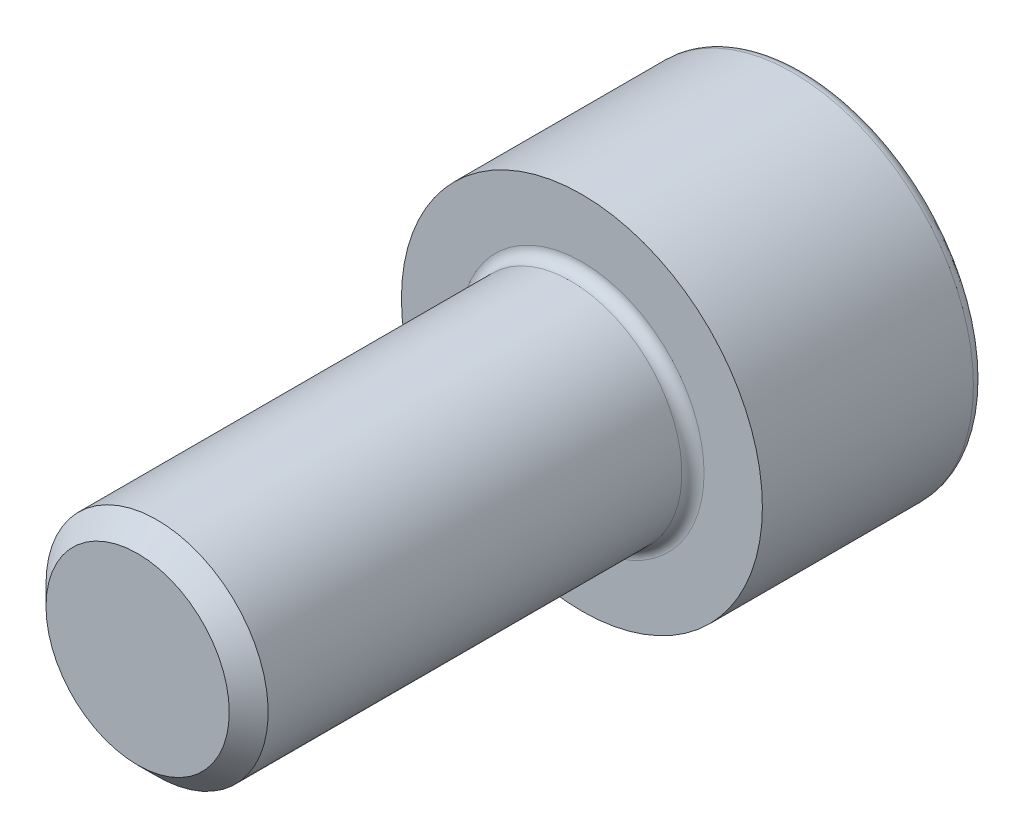
ISO-10303-21;
HEADER;
FILE_DESCRIPTION(('STEP AP214'),'2;1');
FILE_NAME('part.step','',(''),(''),'','','');
FILE_SCHEMA(('AUTOMOTIVE_DESIGN { 1 0 10303 214 1 1 1 1 }'));
ENDSEC;
DATA;
#1=APPLICATION_CONTEXT('core data for automotive mechanical design processes');
#2=APPLICATION_PROTOCOL_DEFINITION('international standard','automotive_design',2000,#1);
#3=PRODUCT_CONTEXT('',#1,'mechanical');
#4=PRODUCT('Part','Part','',(#3));
#5=PRODUCT_RELATED_PRODUCT_CATEGORY('part','',(#4));
#6=PRODUCT_DEFINITION_FORMATION('','',#4);
#7=PRODUCT_DEFINITION_CONTEXT('part definition',#1,'design');
#8=PRODUCT_DEFINITION('design','',#6,#7);
#9=PRODUCT_DEFINITION_SHAPE('','',#8);
#10=(LENGTH_UNIT() NAMED_UNIT(*) SI_UNIT(.MILLI.,.METRE.));
#11=(NAMED_UNIT(*) PLANE_ANGLE_UNIT() SI_UNIT($,.RADIAN.));
#12=(NAMED_UNIT(*) SI_UNIT($,.STERADIAN.) SOLID_ANGLE_UNIT());
#13=UNCERTAINTY_MEASURE_WITH_UNIT(LENGTH_MEASURE(1.E-05),#10,'distance_accuracy_value','');
#14=(GEOMETRIC_REPRESENTATION_CONTEXT(3) GLOBAL_UNCERTAINTY_ASSIGNED_CONTEXT((#13)) GLOBAL_UNIT_ASSIGNED_CONTEXT((#10,
#11,#12)) REPRESENTATION_CONTEXT('',''));
#15=CARTESIAN_POINT('',(0.,0.,0.));
#16=DIRECTION('',(0.,0.,1.));
#17=DIRECTION('',(1.,0.,0.));
#18=AXIS2_PLACEMENT_3D('',#15,#16,#17);
#19=CARTESIAN_POINT('',(-3.57706292844384E-05,-3.96873549196468E-06,-17.1526531246929));
#20=DIRECTION('',(0.,0.,1.));
#21=DIRECTION('',(1.,0.,0.));
#22=AXIS2_PLACEMENT_3D('',#19,#20,#21);
#23=PLANE('',#22);
#24=CARTESIAN_POINT('',(-3.57706292850889E-05,-3.98249819295871E-06,-17.1526531244246));
#25=DIRECTION('',(0.,0.,-1.));
#26=DIRECTION('',(-1.,0.,0.));
#27=AXIS2_PLACEMENT_3D('',#24,#25,#26);
#28=CIRCLE('',#27,1.49999999672391);
#29=CARTESIAN_POINT('',(-1.29907470093307,-0.750002547949316,-17.1526531245587));
#30=VERTEX_POINT('',#29);
#31=CARTESIAN_POINT('',(-0.000137367999756264,-1.50000396873549,-17.1526531253078));
#32=VERTEX_POINT('',#31);
#33=EDGE_CURVE('E140',#30,#32,#28,.F.);
#34=ORIENTED_EDGE('',*,*,#33,.T.);
#35=DIRECTION('',(1.,0.,0.));
#36=VECTOR('',#35,1.);
#37=CARTESIAN_POINT('',(-3.57706292844384E-05,-1.50000396873549,-17.1526531246929));
#38=LINE('',#37,#36);
#39=CARTESIAN_POINT('',(-0.866061174414315,-1.50000396873551,-17.1526531246929));
#40=VERTEX_POINT('',#39);
#41=EDGE_CURVE('E126',#40,#32,#38,.T.);
#42=ORIENTED_EDGE('',*,*,#41,.F.);
#43=DIRECTION('',(0.500000003443144,-0.866025401796539,0.));
#44=VECTOR('',#43,1.);
#45=CARTESIAN_POINT('',(-1.29907553097998,-0.750001109643268,-17.1526531246929));
#46=LINE('',#45,#44);
#47=EDGE_CURVE('E137',#30,#40,#46,.T.);
#48=ORIENTED_EDGE('',*,*,#47,.F.);
#49=EDGE_LOOP('',(#34,#42,#48));
#50=FACE_BOUND('',#49,.T.);
#51=ADVANCED_FACE('F48',(#50),#23,.F.);
#52=CARTESIAN_POINT('',(-3.57706292844384E-05,-3.96873549196468E-06,-17.1526531246929));
#53=DIRECTION('',(0.,0.,1.));
#54=DIRECTION('',(1.,0.,0.));
#55=AXIS2_PLACEMENT_3D('',#52,#53,#54);
#56=PLANE('',#55);
#57=CARTESIAN_POINT('',(-3.57706292850889E-05,-3.98249819295871E-06,-17.1526531259228));
#58=DIRECTION('',(0.,0.,-1.));
#59=DIRECTION('',(-1.,0.,0.));
#60=AXIS2_PLACEMENT_3D('',#57,#58,#59);
#61=CIRCLE('',#60,1.49999999931885);
#62=CARTESIAN_POINT('',(1.29893048860888,-0.750128409735489,-17.1526531253078));
#63=VERTEX_POINT('',#62);
#64=EDGE_CURVE('E145',#32,#63,#61,.F.);
#65=ORIENTED_EDGE('',*,*,#64,.T.);
#66=DIRECTION('',(0.499999999998844,0.866025403785106,0.));
#67=VECTOR('',#66,1.);
#68=CARTESIAN_POINT('',(0.865989633155716,-1.50000396873549,-17.1526531246929));
#69=LINE('',#68,#67);
#70=CARTESIAN_POINT('',(0.865989633155716,-1.50000396873549,-17.1526531246929));
#71=VERTEX_POINT('',#70);
#72=EDGE_CURVE('E153',#71,#63,#69,.T.);
#73=ORIENTED_EDGE('',*,*,#72,.F.);
#74=DIRECTION('',(1.,0.,0.));
#75=VECTOR('',#74,1.);
#76=CARTESIAN_POINT('',(-3.57706292844384E-05,-1.50000396873549,-17.1526531246929));
#77=LINE('',#76,#75);
#78=EDGE_CURVE('E131',#32,#71,#77,.T.);
#79=ORIENTED_EDGE('',*,*,#78,.F.);
#80=EDGE_LOOP('',(#65,#73,#79));
#81=FACE_BOUND('',#80,.T.);
#82=ADVANCED_FACE('F151',(#81),#56,.F.);
#83=CARTESIAN_POINT('',(-3.57706292844384E-05,-3.96873549196468E-06,-17.1526531246929));
#84=DIRECTION('',(0.,0.,1.));
#85=DIRECTION('',(1.,0.,0.));
#86=AXIS2_PLACEMENT_3D('',#83,#84,#85);
#87=PLANE('',#86);
#88=CARTESIAN_POINT('',(-3.57706292850889E-05,-3.98249819295871E-06,-17.1526531273987));
#89=DIRECTION('',(0.,0.,-1.));
#90=DIRECTION('',(-1.,0.,0.));
#91=AXIS2_PLACEMENT_3D('',#88,#89,#90);
#92=CIRCLE('',#91,1.50000000187523);
#93=CARTESIAN_POINT('',(1.29900233802647,0.749996019222277,-17.1526531260458));
#94=VERTEX_POINT('',#93);
#95=CARTESIAN_POINT('',(-3.57706292858009E-05,1.49999602532077,-17.152653128155));
#96=VERTEX_POINT('',#95);
#97=EDGE_CURVE('E161',#94,#96,#92,.F.);
#98=ORIENTED_EDGE('',*,*,#97,.T.);
#99=DIRECTION('',(1.,0.,0.));
#100=VECTOR('',#99,1.);
#101=CARTESIAN_POINT('',(-3.57706292844384E-05,1.49999603126451,-17.1526531246929));
#102=LINE('',#101,#100);
#103=CARTESIAN_POINT('',(0.865989633155747,1.49999603126453,-17.1526531246929));
#104=VERTEX_POINT('',#103);
#105=EDGE_CURVE('E154',#104,#96,#102,.F.);
#106=ORIENTED_EDGE('',*,*,#105,.F.);
#107=DIRECTION('',(-0.499999996558374,0.866025405771463,0.));
#108=VECTOR('',#107,1.);
#109=CARTESIAN_POINT('',(1.29900233802726,0.749996019220906,-17.1526531246929));
#110=LINE('',#109,#108);
#111=EDGE_CURVE('E190',#94,#104,#110,.T.);
#112=ORIENTED_EDGE('',*,*,#111,.F.);
#113=EDGE_LOOP('',(#98,#106,#112));
#114=FACE_BOUND('',#113,.T.);
#115=ADVANCED_FACE('F402',(#114),#87,.F.);
#116=CARTESIAN_POINT('',(-3.57706292844384E-05,-3.96873549196468E-06,-17.1526531246929));
#117=DIRECTION('',(0.,0.,1.));
#118=DIRECTION('',(1.,0.,0.));
#119=AXIS2_PLACEMENT_3D('',#116,#117,#118);
#120=PLANE('',#119);
#121=CARTESIAN_POINT('',(-3.57706292850889E-05,-3.98249819295871E-06,-17.1526531289113));
#122=DIRECTION('',(0.,0.,-1.));
#123=DIRECTION('',(-1.,0.,0.));
#124=AXIS2_PLACEMENT_3D('',#121,#122,#123);
#125=CIRCLE('',#124,1.50000000449511);
#126=CARTESIAN_POINT('',(-1.29907388226579,0.749996018648997,-17.1526531268021));
#127=VERTEX_POINT('',#126);
#128=EDGE_CURVE('E251',#96,#127,#125,.F.);
#129=ORIENTED_EDGE('',*,*,#128,.T.);
#130=DIRECTION('',(-0.499999997706082,-0.866025405108833,0.));
#131=VECTOR('',#130,1.);
#132=CARTESIAN_POINT('',(-0.866061174414285,1.49999603126451,-17.1526531246929));
#133=LINE('',#132,#131);
#134=CARTESIAN_POINT('',(-0.866061177062917,1.49999602667694,-17.1526531248392));
#135=VERTEX_POINT('',#134);
#136=EDGE_CURVE('E181',#135,#127,#133,.T.);
#137=ORIENTED_EDGE('',*,*,#136,.F.);
#138=DIRECTION('',(1.,0.,0.));
#139=VECTOR('',#138,1.);
#140=CARTESIAN_POINT('',(-3.57706292844384E-05,1.49999602438316,-17.1526531246929));
#141=LINE('',#140,#139);
#142=EDGE_CURVE('E177',#96,#135,#141,.F.);
#143=ORIENTED_EDGE('',*,*,#142,.F.);
#144=EDGE_LOOP('',(#129,#137,#143));
#145=FACE_BOUND('',#144,.T.);
#146=ADVANCED_FACE('F401',(#145),#120,.F.);
#147=CARTESIAN_POINT('',(-3.57706292844384E-05,-3.96873549196468E-06,-17.1526531246929));
#148=DIRECTION('',(0.,0.,1.));
#149=DIRECTION('',(1.,0.,0.));
#150=AXIS2_PLACEMENT_3D('',#147,#148,#149);
#151=PLANE('',#150);
#152=CARTESIAN_POINT('',(-3.57706292850889E-05,-3.98249819295871E-06,-17.1526531246929));
#153=DIRECTION('',(0.,0.,1.));
#154=DIRECTION('',(1.,0.,0.));
#155=AXIS2_PLACEMENT_3D('',#152,#153,#154);
#156=CIRCLE('',#155,1.49999999718859);
#157=CARTESIAN_POINT('',(-1.31665651380451,0.71928360542831,-17.1527084552366));
#158=VERTEX_POINT('',#157);
#159=EDGE_CURVE('E245',#158,#30,#156,.T.);
#160=ORIENTED_EDGE('',*,*,#159,.T.);
#161=DIRECTION('',(0.499999996557316,-0.866025405772073,0.));
#162=VECTOR('',#161,1.);
#163=CARTESIAN_POINT('',(-1.73208657819928,-3.96873549140957E-06,-17.1526531246929));
#164=LINE('',#163,#162);
#165=CARTESIAN_POINT('',(-1.73208657819925,-3.96873554512962E-06,-17.1526531246929));
#166=VERTEX_POINT('',#165);
#167=EDGE_CURVE('E172',#166,#30,#164,.T.);
#168=ORIENTED_EDGE('',*,*,#167,.F.);
#169=DIRECTION('',(-0.50000000000019,-0.866025403784329,0.));
#170=VECTOR('',#169,1.);
#171=CARTESIAN_POINT('',(-0.866061174414285,1.49999603126451,-17.1526531246929));
#172=LINE('',#171,#170);
#173=EDGE_CURVE('E146',#158,#166,#172,.T.);
#174=ORIENTED_EDGE('',*,*,#173,.F.);
#175=EDGE_LOOP('',(#160,#168,#174));
#176=FACE_BOUND('',#175,.T.);
#177=ADVANCED_FACE('F284',(#176),#151,.F.);
#178=CARTESIAN_POINT('',(-3.57706292850889E-05,-3.98249819295871E-06,-17.1579705147605));
#179=DIRECTION('',(0.,0.,-1.));
#180=DIRECTION('',(-1.,0.,0.));
#181=AXIS2_PLACEMENT_3D('',#178,#179,#180);
#182=CONICAL_SURFACE('',#181,1.50920998692372,1.04719754999236);
#183=CARTESIAN_POINT('',(-3.57706292844384E-05,-3.98252002103842E-06,-16.2866277201357));
#184=VERTEX_POINT('',#183);
#185=VERTEX_LOOP('',#184);
#186=FACE_BOUND('',#185,.T.);
#187=CARTESIAN_POINT('',(-1.29907388226452,0.749996020945302,-17.1526531302894));
#188=CARTESIAN_POINT('',(-1.3020228956245,0.744888179973625,-17.1526531363409));
#189=CARTESIAN_POINT('',(-1.30497184063231,0.739780457391372,-17.152673218833));
#190=CARTESIAN_POINT('',(-1.31086959393409,0.729565249022178,-17.1527535366981));
#191=CARTESIAN_POINT('',(-1.31381840222807,0.724457763235237,-17.152813772071));
#192=CARTESIAN_POINT('',(-1.31676714216988,0.719350395837719,-17.1528940838843));
#193=B_SPLINE_CURVE_WITH_KNOTS('',3,(#187,#188,#189,#190,#191,#192),.UNSPECIFIED.,.F.,.F.,(4,2,
4),(0.,0.0176937726187948,0.0353875451805484),.UNSPECIFIED.);
#194=EDGE_CURVE('E247',#127,#158,#193,.T.);
#195=ORIENTED_EDGE('',*,*,#194,.F.);
#196=ORIENTED_EDGE('',*,*,#128,.F.);
#197=ORIENTED_EDGE('',*,*,#97,.F.);
#198=CARTESIAN_POINT('',(-3.57706292850889E-05,-3.98249819295871E-06,-17.1526531246929));
#199=DIRECTION('',(0.,0.,1.));
#200=DIRECTION('',(1.,0.,0.));
#201=AXIS2_PLACEMENT_3D('',#198,#199,#200);
#202=CIRCLE('',#201,1.49999999718859);
#203=CARTESIAN_POINT('',(1.31655048280862,-0.719340186139601,-17.1527114429468));
#204=VERTEX_POINT('',#203);
#205=EDGE_CURVE('E238',#94,#204,#202,.F.);
#206=ORIENTED_EDGE('',*,*,#205,.T.);
#207=CARTESIAN_POINT('',(1.29893048595301,-0.750128415018764,-17.1526531263168));
#208=CARTESIAN_POINT('',(1.30188653208498,-0.745008392928671,-17.1526528053978));
#209=CARTESIAN_POINT('',(1.30484250993209,-0.739888489111434,-17.1526726568517));
#210=CARTESIAN_POINT('',(1.31075432904703,-0.729648918039204,-17.1527527045049));
#211=CARTESIAN_POINT('',(1.31371017031486,-0.724529250784209,-17.1528129007041));
#212=CARTESIAN_POINT('',(1.31666594329783,-0.719409701802071,-17.152893269276));
#213=B_SPLINE_CURVE_WITH_KNOTS('',3,(#207,#208,#209,#210,#211,#212),.UNSPECIFIED.,.F.,.F.,(4,2,
4),(0.,0.0177359670696321,0.035471934082007),.UNSPECIFIED.);
#214=EDGE_CURVE('E159',#63,#204,#213,.T.);
#215=ORIENTED_EDGE('',*,*,#214,.F.);
#216=ORIENTED_EDGE('',*,*,#64,.F.);
#217=ORIENTED_EDGE('',*,*,#33,.F.);
#218=ORIENTED_EDGE('',*,*,#159,.F.);
#219=EDGE_LOOP('',(#195,#196,#197,#206,#215,#216,#217,#218));
#220=FACE_BOUND('',#219,.T.);
#221=ADVANCED_FACE('F157',(#186,#220),#182,.F.);
#222=CARTESIAN_POINT('',(-3.57706292844384E-05,-3.96873549196468E-06,-17.1526531246929));
#223=DIRECTION('',(0.,0.,1.));
#224=DIRECTION('',(1.,0.,0.));
#225=AXIS2_PLACEMENT_3D('',#222,#223,#224);
#226=PLANE('',#225);
#227=ORIENTED_EDGE('',*,*,#205,.F.);
#228=DIRECTION('',(-0.500000003442113,0.866025401797133,0.));
#229=VECTOR('',#228,1.);
#230=CARTESIAN_POINT('',(1.73201503694072,-3.96873549174263E-06,-17.1526531246929));
#231=LINE('',#230,#229);
#232=CARTESIAN_POINT('',(1.73201503694069,-3.96873543843223E-06,-17.1526531246929));
#233=VERTEX_POINT('',#232);
#234=EDGE_CURVE('E242',#233,#94,#231,.T.);
#235=ORIENTED_EDGE('',*,*,#234,.F.);
#236=DIRECTION('',(-0.50000000000019,-0.866025403784329,0.));
#237=VECTOR('',#236,1.);
#238=CARTESIAN_POINT('',(1.73201503694062,-3.96873543826053E-06,-17.1526531246929));
#239=LINE('',#238,#237);
#240=EDGE_CURVE('E222',#233,#204,#239,.T.);
#241=ORIENTED_EDGE('',*,*,#240,.T.);
#242=EDGE_LOOP('',(#227,#235,#241));
#243=FACE_BOUND('',#242,.T.);
#244=ADVANCED_FACE('F277',(#243),#226,.F.);
#245=CARTESIAN_POINT('',(0.865989633155716,-1.50000396873549,-19.1526531246929));
#246=DIRECTION('',(0.866025403784329,-0.50000000000019,0.));
#247=DIRECTION('',(0.50000000000019,0.866025403784329,0.));
#248=AXIS2_PLACEMENT_3D('',#245,#246,#247);
#249=PLANE('',#248);
#250=ORIENTED_EDGE('',*,*,#240,.F.);
#251=DIRECTION('',(0.,0.,1.));
#252=VECTOR('',#251,1.);
#253=CARTESIAN_POINT('',(1.73201503694072,-3.96873549159367E-06,-19.1526531246929));
#254=LINE('',#253,#252);
#255=CARTESIAN_POINT('',(1.73201503694067,-3.9687354645447E-06,-19.1526531246929));
#256=VERTEX_POINT('',#255);
#257=EDGE_CURVE('E184',#233,#256,#254,.F.);
#258=ORIENTED_EDGE('',*,*,#257,.T.);
#259=DIRECTION('',(-0.500000000000243,-0.866025403784298,0.));
#260=VECTOR('',#259,1.);
#261=CARTESIAN_POINT('',(1.73201503694072,-3.96873549118752E-06,-19.1526531246929));
#262=LINE('',#261,#260);
#263=CARTESIAN_POINT('',(0.865989633155716,-1.50000396873549,-19.1526531246929));
#264=VERTEX_POINT('',#263);
#265=EDGE_CURVE('E371',#256,#264,#262,.T.);
#266=ORIENTED_EDGE('',*,*,#265,.T.);
#267=DIRECTION('',(0.,0.,-1.));
#268=VECTOR('',#267,1.);
#269=CARTESIAN_POINT('',(0.865989633155716,-1.50000396873549,-19.1526531246929));
#270=LINE('',#269,#268);
#271=EDGE_CURVE('E211',#264,#71,#270,.F.);
#272=ORIENTED_EDGE('',*,*,#271,.T.);
#273=ORIENTED_EDGE('',*,*,#72,.T.);
#274=ORIENTED_EDGE('',*,*,#214,.T.);
#275=EDGE_LOOP('',(#250,#258,#266,#272,#273,#274));
#276=FACE_BOUND('',#275,.T.);
#277=ADVANCED_FACE('F274',(#276),#249,.F.);
#278=CARTESIAN_POINT('',(-0.866061174414285,-1.50000396873549,-19.1526531246929));
#279=DIRECTION('',(0.,-1.,0.));
#280=DIRECTION('',(0.,0.,-1.));
#281=AXIS2_PLACEMENT_3D('',#278,#279,#280);
#282=PLANE('',#281);
#283=ORIENTED_EDGE('',*,*,#78,.T.);
#284=ORIENTED_EDGE('',*,*,#271,.F.);
#285=DIRECTION('',(1.,0.,0.));
#286=VECTOR('',#285,1.);
#287=CARTESIAN_POINT('',(-3.57706292844384E-05,-1.50000396873549,-19.1526531246929));
#288=LINE('',#287,#286);
#289=CARTESIAN_POINT('',(-0.866061174414308,-1.50000396873551,-19.1526531246929));
#290=VERTEX_POINT('',#289);
#291=EDGE_CURVE('E369',#264,#290,#288,.F.);
#292=ORIENTED_EDGE('',*,*,#291,.T.);
#293=DIRECTION('',(0.,0.,1.));
#294=VECTOR('',#293,1.);
#295=CARTESIAN_POINT('',(-0.866061174414377,-1.50000396873555,-19.1526531246929));
#296=LINE('',#295,#294);
#297=EDGE_CURVE('E134',#290,#40,#296,.T.);
#298=ORIENTED_EDGE('',*,*,#297,.T.);
#299=ORIENTED_EDGE('',*,*,#41,.T.);
#300=EDGE_LOOP('',(#283,#284,#292,#298,#299));
#301=FACE_BOUND('',#300,.T.);
#302=ADVANCED_FACE('F128',(#301),#282,.F.);
#303=CARTESIAN_POINT('',(-1.73208657819928,-3.96873549229774E-06,-19.1526531246929));
#304=DIRECTION('',(-0.866025403784329,-0.50000000000019,0.));
#305=DIRECTION('',(0.50000000000019,-0.866025403784329,0.));
#306=AXIS2_PLACEMENT_3D('',#303,#304,#305);
#307=PLANE('',#306);
#308=ORIENTED_EDGE('',*,*,#47,.T.);
#309=ORIENTED_EDGE('',*,*,#297,.F.);
#310=DIRECTION('',(-0.500000000000243,0.866025403784298,0.));
#311=VECTOR('',#310,1.);
#312=CARTESIAN_POINT('',(-0.866061174414285,-1.50000396873549,-19.1526531246929));
#313=LINE('',#312,#311);
#314=CARTESIAN_POINT('',(-1.73208657819924,-3.96873551882694E-06,-19.1526531246929));
#315=VERTEX_POINT('',#314);
#316=EDGE_CURVE('E366',#290,#315,#313,.T.);
#317=ORIENTED_EDGE('',*,*,#316,.T.);
#318=DIRECTION('',(0.,0.,1.));
#319=VECTOR('',#318,1.);
#320=CARTESIAN_POINT('',(-1.73208657819929,-3.96873549161035E-06,-19.1526531246929));
#321=LINE('',#320,#319);
#322=EDGE_CURVE('E209',#166,#315,#321,.F.);
#323=ORIENTED_EDGE('',*,*,#322,.F.);
#324=ORIENTED_EDGE('',*,*,#167,.T.);
#325=EDGE_LOOP('',(#308,#309,#317,#323,#324));
#326=FACE_BOUND('',#325,.T.);
#327=ADVANCED_FACE('F269',(#326),#307,.F.);
#328=CARTESIAN_POINT('',(-0.866061174414285,1.49999603126451,-19.1526531246929));
#329=DIRECTION('',(-0.866025403784329,0.50000000000019,0.));
#330=DIRECTION('',(-0.50000000000019,-0.866025403784329,0.));
#331=AXIS2_PLACEMENT_3D('',#328,#329,#330);
#332=PLANE('',#331);
#333=ORIENTED_EDGE('',*,*,#194,.T.);
#334=ORIENTED_EDGE('',*,*,#173,.T.);
#335=ORIENTED_EDGE('',*,*,#322,.T.);
#336=DIRECTION('',(0.499999999748507,0.866025403929638,0.));
#337=VECTOR('',#336,1.);
#338=CARTESIAN_POINT('',(-1.31677132100652,0.719343157356388,-19.1526531246929));
#339=LINE('',#338,#337);
#340=CARTESIAN_POINT('',(-0.866061174414285,1.49999603126451,-19.1526531246929));
#341=VERTEX_POINT('',#340);
#342=EDGE_CURVE('E364',#315,#341,#339,.T.);
#343=ORIENTED_EDGE('',*,*,#342,.T.);
#344=DIRECTION('',(0.,0.,1.));
#345=VECTOR('',#344,1.);
#346=CARTESIAN_POINT('',(-0.866061174414285,1.49999603126451,-19.1526531246929));
#347=LINE('',#346,#345);
#348=EDGE_CURVE('E212',#341,#135,#347,.T.);
#349=ORIENTED_EDGE('',*,*,#348,.T.);
#350=ORIENTED_EDGE('',*,*,#136,.T.);
#351=EDGE_LOOP('',(#333,#334,#335,#343,#349,#350));
#352=FACE_BOUND('',#351,.T.);
#353=ADVANCED_FACE('F263',(#352),#332,.F.);
#354=CARTESIAN_POINT('',(0.865989633155716,1.49999603126451,-19.1526531246929));
#355=DIRECTION('',(0.,1.,0.));
#356=DIRECTION('',(0.,0.,1.));
#357=AXIS2_PLACEMENT_3D('',#354,#355,#356);
#358=PLANE('',#357);
#359=ORIENTED_EDGE('',*,*,#142,.T.);
#360=ORIENTED_EDGE('',*,*,#348,.F.);
#361=DIRECTION('',(1.,0.,0.));
#362=VECTOR('',#361,1.);
#363=CARTESIAN_POINT('',(-3.57706292844384E-05,1.49999603126451,-19.1526531246929));
#364=LINE('',#363,#362);
#365=CARTESIAN_POINT('',(0.865989633155739,1.49999603126452,-19.1526531246929));
#366=VERTEX_POINT('',#365);
#367=EDGE_CURVE('E66',#341,#366,#364,.T.);
#368=ORIENTED_EDGE('',*,*,#367,.T.);
#369=DIRECTION('',(0.,0.,1.));
#370=VECTOR('',#369,1.);
#371=CARTESIAN_POINT('',(0.865989633155808,1.49999603126456,-19.1526531246929));
#372=LINE('',#371,#370);
#373=EDGE_CURVE('E215',#366,#104,#372,.T.);
#374=ORIENTED_EDGE('',*,*,#373,.T.);
#375=ORIENTED_EDGE('',*,*,#105,.T.);
#376=EDGE_LOOP('',(#359,#360,#368,#374,#375));
#377=FACE_BOUND('',#376,.T.);
#378=ADVANCED_FACE('F268',(#377),#358,.F.);
#379=CARTESIAN_POINT('',(1.73201503694072,-3.96873549118752E-06,-19.1526531246929));
#380=DIRECTION('',(0.866025403784329,0.50000000000019,0.));
#381=DIRECTION('',(-0.50000000000019,0.866025403784329,0.));
#382=AXIS2_PLACEMENT_3D('',#379,#380,#381);
#383=PLANE('',#382);
#384=ORIENTED_EDGE('',*,*,#257,.F.);
#385=ORIENTED_EDGE('',*,*,#234,.T.);
#386=ORIENTED_EDGE('',*,*,#111,.T.);
#387=ORIENTED_EDGE('',*,*,#373,.F.);
#388=DIRECTION('',(0.500000000000243,-0.866025403784298,0.));
#389=VECTOR('',#388,1.);
#390=CARTESIAN_POINT('',(0.865989633155716,1.49999603126451,-19.1526531246929));
#391=LINE('',#390,#389);
#392=EDGE_CURVE('E355',#366,#256,#391,.T.);
#393=ORIENTED_EDGE('',*,*,#392,.T.);
#394=EDGE_LOOP('',(#384,#385,#386,#387,#393));
#395=FACE_BOUND('',#394,.T.);
#396=ADVANCED_FACE('F385',(#395),#383,.F.);
#397=CARTESIAN_POINT('',(-3.57706292844384E-05,-3.96873549196468E-06,-19.1526531246929));
#398=DIRECTION('',(0.,0.,1.));
#399=DIRECTION('',(1.,0.,0.));
#400=AXIS2_PLACEMENT_3D('',#397,#398,#399);
#401=PLANE('',#400);
#402=ORIENTED_EDGE('',*,*,#367,.F.);
#403=ORIENTED_EDGE('',*,*,#342,.F.);
#404=ORIENTED_EDGE('',*,*,#316,.F.);
#405=ORIENTED_EDGE('',*,*,#291,.F.);
#406=ORIENTED_EDGE('',*,*,#265,.F.);
#407=ORIENTED_EDGE('',*,*,#392,.F.);
#408=EDGE_LOOP('',(#402,#403,#404,#405,#406,#407));
#409=FACE_BOUND('',#408,.T.);
#410=CARTESIAN_POINT('',(-3.57706292846604E-05,-3.9687354910765E-06,-19.1526531246929));
#411=DIRECTION('',(0.,0.,1.));
#412=DIRECTION('',(-0.999999999999999,-4.49714278382352E-08,0.));
#413=AXIS2_PLACEMENT_3D('',#410,#411,#412);
#414=CIRCLE('',#413,3.05);
#415=CARTESIAN_POINT('',(-3.05003577062928,-4.10589834598312E-06,-19.1526531246929));
#416=VERTEX_POINT('',#415);
#417=EDGE_CURVE('E351',#416,#416,#414,.T.);
#418=ORIENTED_EDGE('',*,*,#417,.F.);
#419=EDGE_LOOP('',(#418));
#420=FACE_BOUND('',#419,.T.);
#421=ADVANCED_FACE('F338',(#409,#420),#401,.F.);
#422=CARTESIAN_POINT('',(-3.57706292846604E-05,-3.9687354910765E-06,-18.9526531246929));
#423=DIRECTION('',(0.,0.,-1.));
#424=DIRECTION('',(1.,0.,0.));
#425=AXIS2_PLACEMENT_3D('',#422,#423,#424);
#426=TOROIDAL_SURFACE('',#425,3.05,0.2);
#427=CARTESIAN_POINT('',(-3.57706292844384E-05,-3.96873549196468E-06,-18.9526531246929));
#428=DIRECTION('',(0.,0.,1.));
#429=DIRECTION('',(1.,0.,0.));
#430=AXIS2_PLACEMENT_3D('',#427,#428,#429);
#431=CIRCLE('',#430,3.25);
#432=CARTESIAN_POINT('',(3.24996422937072,-3.96873549196468E-06,-18.9526531246929));
#433=VERTEX_POINT('',#432);
#434=EDGE_CURVE('E235',#433,#433,#431,.T.);
#435=ORIENTED_EDGE('',*,*,#434,.F.);
#436=EDGE_LOOP('',(#435));
#437=FACE_BOUND('',#436,.T.);
#438=ORIENTED_EDGE('',*,*,#417,.T.);
#439=EDGE_LOOP('',(#438));
#440=FACE_BOUND('',#439,.T.);
#441=ADVANCED_FACE('F332',(#437,#440),#426,.T.);
#442=CARTESIAN_POINT('',(-3.57706292844384E-05,-3.96873549196468E-06,-13.1526531246929));
#443=DIRECTION('',(0.,0.,1.));
#444=DIRECTION('',(1.,0.,0.));
#445=AXIS2_PLACEMENT_3D('',#442,#443,#444);
#446=CYLINDRICAL_SURFACE('',#445,3.25);
#447=CARTESIAN_POINT('',(-3.57706292844384E-05,-3.96873549196468E-06,-15.1526531246929));
#448=DIRECTION('',(0.,0.,1.));
#449=DIRECTION('',(1.,0.,0.));
#450=AXIS2_PLACEMENT_3D('',#447,#448,#449);
#451=CIRCLE('',#450,3.25);
#452=CARTESIAN_POINT('',(3.24996422937072,-3.96873549196468E-06,-15.1526531246929));
#453=VERTEX_POINT('',#452);
#454=EDGE_CURVE('E232',#453,#453,#451,.F.);
#455=ORIENTED_EDGE('',*,*,#454,.T.);
#456=EDGE_LOOP('',(#455));
#457=FACE_BOUND('',#456,.T.);
#458=ORIENTED_EDGE('',*,*,#434,.T.);
#459=EDGE_LOOP('',(#458));
#460=FACE_BOUND('',#459,.T.);
#461=ADVANCED_FACE('F329',(#457,#460),#446,.T.);
#462=CARTESIAN_POINT('',(-3.57706292844384E-05,-3.96873549196468E-06,-15.1526531246929));
#463=DIRECTION('',(0.,0.,-1.));
#464=DIRECTION('',(-1.,0.,0.));
#465=AXIS2_PLACEMENT_3D('',#462,#463,#464);
#466=PLANE('',#465);
#467=CARTESIAN_POINT('',(-3.57706292918769E-05,-3.96873552549341E-06,-15.1526531246929));
#468=DIRECTION('',(0.,0.,1.));
#469=DIRECTION('',(-1.,0.,0.));
#470=AXIS2_PLACEMENT_3D('',#467,#468,#469);
#471=CIRCLE('',#470,2.2);
#472=CARTESIAN_POINT('',(-2.20003577062929,-3.96873552549341E-06,-15.1526531246929));
#473=VERTEX_POINT('',#472);
#474=EDGE_CURVE('E231',#473,#473,#471,.F.);
#475=ORIENTED_EDGE('',*,*,#474,.T.);
#476=EDGE_LOOP('',(#475));
#477=FACE_BOUND('',#476,.T.);
#478=ORIENTED_EDGE('',*,*,#454,.F.);
#479=EDGE_LOOP('',(#478));
#480=FACE_BOUND('',#479,.T.);
#481=ADVANCED_FACE('F320',(#477,#480),#466,.F.);
#482=CARTESIAN_POINT('',(-3.57706292844384E-05,-3.96873549196468E-06,-7.15265312469288));
#483=DIRECTION('',(0.,0.,1.));
#484=DIRECTION('',(1.,0.,0.));
#485=AXIS2_PLACEMENT_3D('',#482,#483,#484);
#486=PLANE('',#485);
#487=CARTESIAN_POINT('',(-3.57706292131534E-05,-3.96873546542915E-06,-7.15265312574414));
#488=DIRECTION('',(-2.0429079449186E-13,0.,-1.));
#489=DIRECTION('',(-1.,0.,2.0429079449186E-13));
#490=AXIS2_PLACEMENT_3D('',#487,#488,#489);
#491=CIRCLE('',#490,1.64999999898889);
#492=CARTESIAN_POINT('',(-1.6500357696181,-3.96873546542915E-06,-7.1526531257438));
#493=VERTEX_POINT('',#492);
#494=EDGE_CURVE('E228',#493,#493,#491,.T.);
#495=ORIENTED_EDGE('',*,*,#494,.F.);
#496=EDGE_LOOP('',(#495));
#497=FACE_BOUND('',#496,.T.);
#498=ADVANCED_FACE('F304',(#497),#486,.T.);
#499=CARTESIAN_POINT('',(-3.57706292918769E-05,-3.96873552549341E-06,-14.9526531246929));
#500=DIRECTION('',(0.,0.,1.));
#501=DIRECTION('',(-1.,0.,0.));
#502=AXIS2_PLACEMENT_3D('',#499,#500,#501);
#503=TOROIDAL_SURFACE('',#502,2.2,0.2);
#504=ORIENTED_EDGE('',*,*,#474,.F.);
#505=EDGE_LOOP('',(#504));
#506=FACE_BOUND('',#505,.T.);
#507=CARTESIAN_POINT('',(-3.57706292844384E-05,-3.96873549196468E-06,-14.9526531246929));
#508=DIRECTION('',(0.,0.,-1.));
#509=DIRECTION('',(-1.,0.,0.));
#510=AXIS2_PLACEMENT_3D('',#507,#508,#509);
#511=CIRCLE('',#510,2.);
#512=CARTESIAN_POINT('',(-2.00003577062928,-3.96873549196468E-06,-14.9526531246929));
#513=VERTEX_POINT('',#512);
#514=EDGE_CURVE('E57',#513,#513,#511,.F.);
#515=ORIENTED_EDGE('',*,*,#514,.F.);
#516=EDGE_LOOP('',(#515));
#517=FACE_BOUND('',#516,.T.);
#518=ADVANCED_FACE('F295',(#506,#517),#503,.F.);
#519=CARTESIAN_POINT('',(-3.57706292846552E-05,-3.9687354916316E-06,-7.50265312599727));
#520=DIRECTION('',(-2.0429079449186E-13,0.,-1.));
#521=DIRECTION('',(-1.,0.,2.0429079449186E-13));
#522=AXIS2_PLACEMENT_3D('',#519,#520,#521);
#523=CONICAL_SURFACE('',#522,1.99999999861689,0.785398162504399);
#524=CARTESIAN_POINT('',(-3.57706292844384E-05,-3.96873549196468E-06,-7.50265312469288));
#525=DIRECTION('',(0.,0.,-1.));
#526=DIRECTION('',(-1.,0.,0.));
#527=AXIS2_PLACEMENT_3D('',#524,#525,#526);
#528=CIRCLE('',#527,2.);
#529=CARTESIAN_POINT('',(-2.00003577062928,-3.96873549196468E-06,-7.50265312469288));
#530=VERTEX_POINT('',#529);
#531=EDGE_CURVE('E13',#530,#530,#528,.T.);
#532=ORIENTED_EDGE('',*,*,#531,.F.);
#533=EDGE_LOOP('',(#532));
#534=FACE_BOUND('',#533,.T.);
#535=ORIENTED_EDGE('',*,*,#494,.T.);
#536=EDGE_LOOP('',(#535));
#537=FACE_BOUND('',#536,.T.);
#538=ADVANCED_FACE('F289',(#534,#537),#523,.T.);
#539=CARTESIAN_POINT('',(-3.57706292844384E-05,-3.96873549196468E-06,-11.1526531246929));
#540=DIRECTION('',(0.,0.,-1.));
#541=DIRECTION('',(-1.,0.,0.));
#542=AXIS2_PLACEMENT_3D('',#539,#540,#541);
#543=CYLINDRICAL_SURFACE('',#542,2.);
#544=ORIENTED_EDGE('',*,*,#531,.T.);
#545=EDGE_LOOP('',(#544));
#546=FACE_BOUND('',#545,.T.);
#547=ORIENTED_EDGE('',*,*,#514,.T.);
#548=EDGE_LOOP('',(#547));
#549=FACE_BOUND('',#548,.T.);
#550=ADVANCED_FACE('F287',(#546,#549),#543,.T.);
#551=CLOSED_SHELL('',(#51,#82,#115,#146,#177,#221,#244,#277,#302,#327,#353,#378,#396,#421,#441,
#461,#481,#498,#518,#538,#550));
#552=MANIFOLD_SOLID_BREP('B2',#551);
#553=ADVANCED_BREP_SHAPE_REPRESENTATION('',(#18,#552),#14);
#554=SHAPE_DEFINITION_REPRESENTATION(#9,#553);
ENDSEC;
END-ISO-10303-21;
